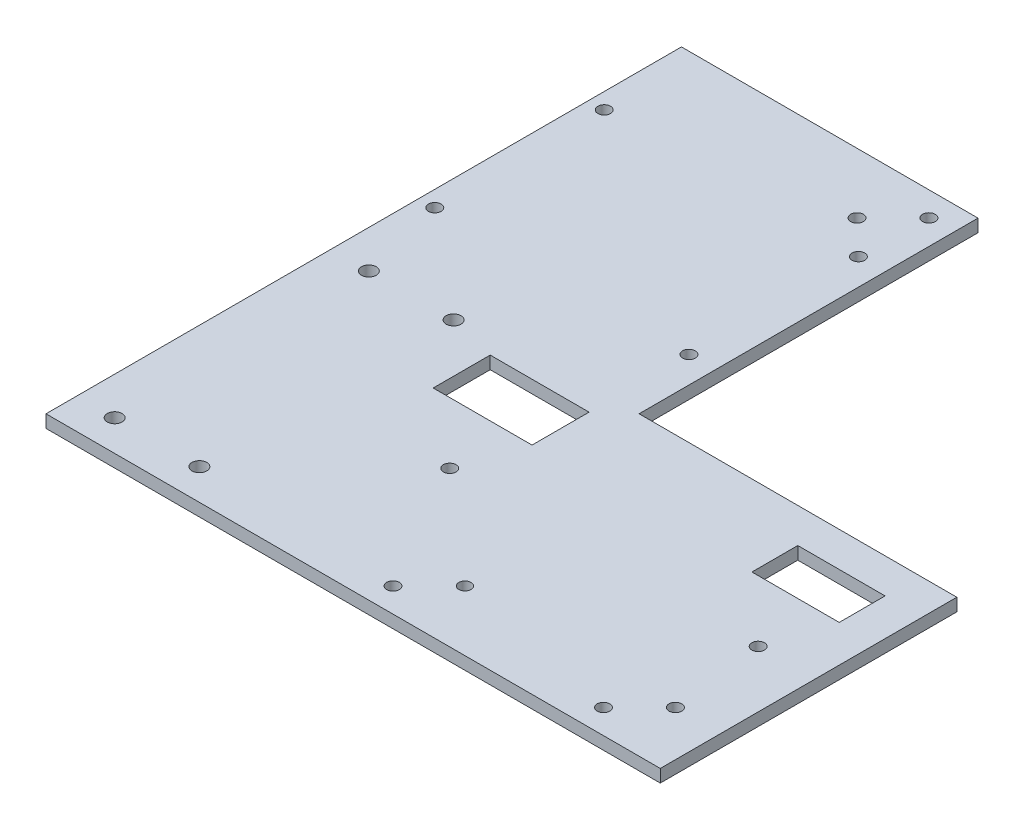
ISO-10303-21;
HEADER;
FILE_DESCRIPTION(('STEP AP214'),'2;1');
FILE_NAME('part.step','',(''),(''),'','','');
FILE_SCHEMA(('AUTOMOTIVE_DESIGN { 1 0 10303 214 1 1 1 1 }'));
ENDSEC;
DATA;
#1=APPLICATION_CONTEXT('core data for automotive mechanical design processes');
#2=APPLICATION_PROTOCOL_DEFINITION('international standard','automotive_design',2000,#1);
#3=PRODUCT_CONTEXT('',#1,'mechanical');
#4=PRODUCT('Part','Part','',(#3));
#5=PRODUCT_RELATED_PRODUCT_CATEGORY('part','',(#4));
#6=PRODUCT_DEFINITION_FORMATION('','',#4);
#7=PRODUCT_DEFINITION_CONTEXT('part definition',#1,'design');
#8=PRODUCT_DEFINITION('design','',#6,#7);
#9=PRODUCT_DEFINITION_SHAPE('','',#8);
#10=(LENGTH_UNIT() NAMED_UNIT(*) SI_UNIT(.MILLI.,.METRE.));
#11=(NAMED_UNIT(*) PLANE_ANGLE_UNIT() SI_UNIT($,.RADIAN.));
#12=(NAMED_UNIT(*) SI_UNIT($,.STERADIAN.) SOLID_ANGLE_UNIT());
#13=UNCERTAINTY_MEASURE_WITH_UNIT(LENGTH_MEASURE(1.E-05),#10,'distance_accuracy_value','');
#14=(GEOMETRIC_REPRESENTATION_CONTEXT(3) GLOBAL_UNCERTAINTY_ASSIGNED_CONTEXT((#13)) GLOBAL_UNIT_ASSIGNED_CONTEXT((#10,
#11,#12)) REPRESENTATION_CONTEXT('',''));
#15=CARTESIAN_POINT('',(0.,0.,0.));
#16=DIRECTION('',(0.,0.,1.));
#17=DIRECTION('',(1.,0.,0.));
#18=AXIS2_PLACEMENT_3D('',#15,#16,#17);
#19=CARTESIAN_POINT('',(0.,3.,0.));
#20=DIRECTION('',(0.,1.,0.));
#21=DIRECTION('',(0.,0.,1.));
#22=AXIS2_PLACEMENT_3D('',#19,#20,#21);
#23=PLANE('',#22);
#24=CARTESIAN_POINT('',(-8.74039531155943,3.,-93.0097306320693));
#25=DIRECTION('',(0.,1.,0.));
#26=DIRECTION('',(0.,0.,1.));
#27=AXIS2_PLACEMENT_3D('',#24,#25,#26);
#28=CIRCLE('',#27,1.5);
#29=CARTESIAN_POINT('',(-8.74039531155943,3.,-91.5097306320693));
#30=VERTEX_POINT('',#29);
#31=EDGE_CURVE('E211',#30,#30,#28,.T.);
#32=ORIENTED_EDGE('',*,*,#31,.F.);
#33=EDGE_LOOP('',(#32));
#34=FACE_BOUND('',#33,.T.);
#35=CARTESIAN_POINT('',(-68.7403953115594,3.,-53.0097306320694));
#36=DIRECTION('',(0.,1.,0.));
#37=DIRECTION('',(0.,0.,1.));
#38=AXIS2_PLACEMENT_3D('',#35,#36,#37);
#39=CIRCLE('',#38,1.5);
#40=CARTESIAN_POINT('',(-68.7403953115594,3.,-51.5097306320694));
#41=VERTEX_POINT('',#40);
#42=EDGE_CURVE('E223',#41,#41,#39,.T.);
#43=ORIENTED_EDGE('',*,*,#42,.F.);
#44=EDGE_LOOP('',(#43));
#45=FACE_BOUND('',#44,.T.);
#46=CARTESIAN_POINT('',(-43.5845661937759,3.,-32.2893631834184));
#47=DIRECTION('',(0.,1.,0.));
#48=DIRECTION('',(0.,0.,1.));
#49=AXIS2_PLACEMENT_3D('',#46,#47,#48);
#50=CIRCLE('',#49,1.75);
#51=CARTESIAN_POINT('',(-43.5845661937759,3.,-30.5393631834184));
#52=VERTEX_POINT('',#51);
#53=EDGE_CURVE('E235',#52,#52,#50,.T.);
#54=ORIENTED_EDGE('',*,*,#53,.F.);
#55=EDGE_LOOP('',(#54));
#56=FACE_BOUND('',#55,.T.);
#57=CARTESIAN_POINT('',(-63.5845661937668,3.,27.7106368165827));
#58=DIRECTION('',(0.,1.,0.));
#59=DIRECTION('',(0.,0.,1.));
#60=AXIS2_PLACEMENT_3D('',#57,#58,#59);
#61=CIRCLE('',#60,1.75);
#62=CARTESIAN_POINT('',(-63.5845661937668,3.,29.4606368165827));
#63=VERTEX_POINT('',#62);
#64=EDGE_CURVE('E247',#63,#63,#61,.T.);
#65=ORIENTED_EDGE('',*,*,#64,.F.);
#66=EDGE_LOOP('',(#65));
#67=FACE_BOUND('',#66,.T.);
#68=CARTESIAN_POINT('',(-13.6998219902886,3.,-1.50000000000002));
#69=DIRECTION('',(0.,1.,0.));
#70=DIRECTION('',(0.,0.,1.));
#71=AXIS2_PLACEMENT_3D('',#68,#69,#70);
#72=CIRCLE('',#71,1.5);
#73=CARTESIAN_POINT('',(-13.6998219902886,3.,0.));
#74=VERTEX_POINT('',#73);
#75=EDGE_CURVE('E259',#74,#74,#72,.T.);
#76=ORIENTED_EDGE('',*,*,#75,.F.);
#77=EDGE_LOOP('',(#76));
#78=FACE_BOUND('',#77,.T.);
#79=CARTESIAN_POINT('',(-16.8143550150383,3.,-100.757359312881));
#80=DIRECTION('',(0.,1.,0.));
#81=DIRECTION('',(0.,0.,1.));
#82=AXIS2_PLACEMENT_3D('',#79,#80,#81);
#83=CIRCLE('',#82,1.5);
#84=CARTESIAN_POINT('',(-16.8143550150383,3.,-99.2573593128807));
#85=VERTEX_POINT('',#84);
#86=EDGE_CURVE('E271',#85,#85,#83,.T.);
#87=ORIENTED_EDGE('',*,*,#86,.F.);
#88=EDGE_LOOP('',(#87));
#89=FACE_BOUND('',#88,.T.);
#90=CARTESIAN_POINT('',(53.3380950751253,3.,29.2426406871193));
#91=DIRECTION('',(0.,1.,0.));
#92=DIRECTION('',(0.,0.,1.));
#93=AXIS2_PLACEMENT_3D('',#90,#91,#92);
#94=CIRCLE('',#93,1.5);
#95=CARTESIAN_POINT('',(53.3380950751253,3.,30.7426406871193));
#96=VERTEX_POINT('',#95);
#97=EDGE_CURVE('E283',#96,#96,#94,.T.);
#98=ORIENTED_EDGE('',*,*,#97,.F.);
#99=EDGE_LOOP('',(#98));
#100=FACE_BOUND('',#99,.T.);
#101=CARTESIAN_POINT('',(3.6548279936358,3.,29.2426406871193));
#102=DIRECTION('',(0.,1.,0.));
#103=DIRECTION('',(0.,0.,1.));
#104=AXIS2_PLACEMENT_3D('',#101,#102,#103);
#105=CIRCLE('',#104,1.5);
#106=CARTESIAN_POINT('',(3.6548279936358,3.,30.7426406871193));
#107=VERTEX_POINT('',#106);
#108=EDGE_CURVE('E295',#107,#107,#105,.T.);
#109=ORIENTED_EDGE('',*,*,#108,.F.);
#110=EDGE_LOOP('',(#109));
#111=FACE_BOUND('',#110,.T.);
#112=DIRECTION('',(-1.,0.,0.));
#113=VECTOR('',#112,1.);
#114=CARTESIAN_POINT('',(-2.50000000000002,3.,-35.));
#115=LINE('',#114,#113);
#116=CARTESIAN_POINT('',(72.5,3.,-35.));
#117=VERTEX_POINT('',#116);
#118=CARTESIAN_POINT('',(-2.50000000000002,3.,-35.));
#119=VERTEX_POINT('',#118);
#120=EDGE_CURVE('E301',#117,#119,#115,.T.);
#121=ORIENTED_EDGE('',*,*,#120,.T.);
#122=DIRECTION('',(0.,0.,-1.));
#123=VECTOR('',#122,1.);
#124=CARTESIAN_POINT('',(-2.50000000000002,3.,-35.));
#125=LINE('',#124,#123);
#126=CARTESIAN_POINT('',(-2.50000000000002,3.,-115.));
#127=VERTEX_POINT('',#126);
#128=EDGE_CURVE('E304',#119,#127,#125,.T.);
#129=ORIENTED_EDGE('',*,*,#128,.T.);
#130=DIRECTION('',(-1.,0.,0.));
#131=VECTOR('',#130,1.);
#132=CARTESIAN_POINT('',(-72.5,3.,-115.));
#133=LINE('',#132,#131);
#134=CARTESIAN_POINT('',(-72.5,3.,-115.));
#135=VERTEX_POINT('',#134);
#136=EDGE_CURVE('E307',#127,#135,#133,.T.);
#137=ORIENTED_EDGE('',*,*,#136,.T.);
#138=DIRECTION('',(0.,0.,1.));
#139=VECTOR('',#138,1.);
#140=CARTESIAN_POINT('',(-72.5,3.,-35.));
#141=LINE('',#140,#139);
#142=CARTESIAN_POINT('',(-72.5,3.,35.));
#143=VERTEX_POINT('',#142);
#144=EDGE_CURVE('E309',#135,#143,#141,.T.);
#145=ORIENTED_EDGE('',*,*,#144,.T.);
#146=DIRECTION('',(1.,0.,0.));
#147=VECTOR('',#146,1.);
#148=CARTESIAN_POINT('',(-72.5,3.,35.));
#149=LINE('',#148,#147);
#150=CARTESIAN_POINT('',(72.5,3.,35.));
#151=VERTEX_POINT('',#150);
#152=EDGE_CURVE('E311',#143,#151,#149,.T.);
#153=ORIENTED_EDGE('',*,*,#152,.T.);
#154=DIRECTION('',(0.,0.,-1.));
#155=VECTOR('',#154,1.);
#156=CARTESIAN_POINT('',(72.5,3.,35.));
#157=LINE('',#156,#155);
#158=EDGE_CURVE('E313',#151,#117,#157,.T.);
#159=ORIENTED_EDGE('',*,*,#158,.T.);
#160=EDGE_LOOP('',(#121,#129,#137,#145,#153,#159));
#161=FACE_BOUND('',#160,.T.);
#162=CARTESIAN_POINT('',(12.1401093678744,3.,20.7573593128807));
#163=DIRECTION('',(0.,1.,0.));
#164=DIRECTION('',(0.,0.,1.));
#165=AXIS2_PLACEMENT_3D('',#162,#163,#164);
#166=CIRCLE('',#165,1.44463942022742);
#167=CARTESIAN_POINT('',(12.1401093678744,3.,22.2019987331082));
#168=VERTEX_POINT('',#167);
#169=EDGE_CURVE('E289',#168,#168,#166,.T.);
#170=ORIENTED_EDGE('',*,*,#169,.F.);
#171=EDGE_LOOP('',(#170));
#172=FACE_BOUND('',#171,.T.);
#173=CARTESIAN_POINT('',(61.8233764493638,3.,20.7573593128807));
#174=DIRECTION('',(0.,1.,0.));
#175=DIRECTION('',(0.,0.,1.));
#176=AXIS2_PLACEMENT_3D('',#173,#174,#175);
#177=CIRCLE('',#176,1.49999999999998);
#178=CARTESIAN_POINT('',(61.8233764493638,3.,22.2573593128807));
#179=VERTEX_POINT('',#178);
#180=EDGE_CURVE('E277',#179,#179,#177,.T.);
#181=ORIENTED_EDGE('',*,*,#180,.F.);
#182=EDGE_LOOP('',(#181));
#183=FACE_BOUND('',#182,.T.);
#184=CARTESIAN_POINT('',(-8.32907364079969,3.,-109.242640687119));
#185=DIRECTION('',(0.,1.,0.));
#186=DIRECTION('',(0.,0.,1.));
#187=AXIS2_PLACEMENT_3D('',#184,#185,#186);
#188=CIRCLE('',#187,1.5);
#189=CARTESIAN_POINT('',(-8.32907364079969,3.,-107.742640687119));
#190=VERTEX_POINT('',#189);
#191=EDGE_CURVE('E265',#190,#190,#188,.T.);
#192=ORIENTED_EDGE('',*,*,#191,.F.);
#193=EDGE_LOOP('',(#192));
#194=FACE_BOUND('',#193,.T.);
#195=CARTESIAN_POINT('',(59.1092379606102,3.,-1.50000000000002));
#196=DIRECTION('',(0.,1.,0.));
#197=DIRECTION('',(0.,0.,1.));
#198=AXIS2_PLACEMENT_3D('',#195,#196,#197);
#199=CIRCLE('',#198,1.5);
#200=CARTESIAN_POINT('',(59.1092379606102,3.,0.));
#201=VERTEX_POINT('',#200);
#202=EDGE_CURVE('E253',#201,#201,#199,.T.);
#203=ORIENTED_EDGE('',*,*,#202,.F.);
#204=EDGE_LOOP('',(#203));
#205=FACE_BOUND('',#204,.T.);
#206=CARTESIAN_POINT('',(-43.5845661937759,3.,27.7106368165827));
#207=DIRECTION('',(0.,1.,0.));
#208=DIRECTION('',(0.,0.,1.));
#209=AXIS2_PLACEMENT_3D('',#206,#207,#208);
#210=CIRCLE('',#209,1.75);
#211=CARTESIAN_POINT('',(-43.5845661937759,3.,29.4606368165827));
#212=VERTEX_POINT('',#211);
#213=EDGE_CURVE('E241',#212,#212,#210,.T.);
#214=ORIENTED_EDGE('',*,*,#213,.F.);
#215=EDGE_LOOP('',(#214));
#216=FACE_BOUND('',#215,.T.);
#217=CARTESIAN_POINT('',(-63.5845661937668,3.,-32.2893631834184));
#218=DIRECTION('',(0.,1.,0.));
#219=DIRECTION('',(0.,0.,1.));
#220=AXIS2_PLACEMENT_3D('',#217,#218,#219);
#221=CIRCLE('',#220,1.75);
#222=CARTESIAN_POINT('',(-63.5845661937668,3.,-30.5393631834184));
#223=VERTEX_POINT('',#222);
#224=EDGE_CURVE('E229',#223,#223,#221,.T.);
#225=ORIENTED_EDGE('',*,*,#224,.F.);
#226=EDGE_LOOP('',(#225));
#227=FACE_BOUND('',#226,.T.);
#228=CARTESIAN_POINT('',(-68.7403953115594,3.,-93.0097306320693));
#229=DIRECTION('',(0.,1.,0.));
#230=DIRECTION('',(0.,0.,1.));
#231=AXIS2_PLACEMENT_3D('',#228,#229,#230);
#232=CIRCLE('',#231,1.5);
#233=CARTESIAN_POINT('',(-68.7403953115594,3.,-91.5097306320693));
#234=VERTEX_POINT('',#233);
#235=EDGE_CURVE('E217',#234,#234,#232,.T.);
#236=ORIENTED_EDGE('',*,*,#235,.F.);
#237=EDGE_LOOP('',(#236));
#238=FACE_BOUND('',#237,.T.);
#239=CARTESIAN_POINT('',(-8.74039531155943,3.,-53.0097306320694));
#240=DIRECTION('',(0.,1.,0.));
#241=DIRECTION('',(0.,0.,1.));
#242=AXIS2_PLACEMENT_3D('',#239,#240,#241);
#243=CIRCLE('',#242,1.5);
#244=CARTESIAN_POINT('',(-8.74039531155943,3.,-51.5097306320694));
#245=VERTEX_POINT('',#244);
#246=EDGE_CURVE('E205',#245,#245,#243,.T.);
#247=ORIENTED_EDGE('',*,*,#246,.F.);
#248=EDGE_LOOP('',(#247));
#249=FACE_BOUND('',#248,.T.);
#250=DIRECTION('',(-1.,0.,0.));
#251=VECTOR('',#250,1.);
#252=CARTESIAN_POINT('',(-32.07311887779,3.,-29.429238987531));
#253=LINE('',#252,#251);
#254=CARTESIAN_POINT('',(-8.74039531155943,3.,-29.429238987531));
#255=VERTEX_POINT('',#254);
#256=CARTESIAN_POINT('',(-32.07311887779,3.,-29.429238987531));
#257=VERTEX_POINT('',#256);
#258=EDGE_CURVE('E176',#255,#257,#253,.T.);
#259=ORIENTED_EDGE('',*,*,#258,.F.);
#260=DIRECTION('',(0.,0.,-1.));
#261=VECTOR('',#260,1.);
#262=CARTESIAN_POINT('',(-8.74039531155943,3.,-15.970761012469));
#263=LINE('',#262,#261);
#264=CARTESIAN_POINT('',(-8.74039531155943,3.,-15.970761012469));
#265=VERTEX_POINT('',#264);
#266=EDGE_CURVE('E174',#265,#255,#263,.T.);
#267=ORIENTED_EDGE('',*,*,#266,.F.);
#268=DIRECTION('',(1.,0.,0.));
#269=VECTOR('',#268,1.);
#270=CARTESIAN_POINT('',(-32.07311887779,3.,-15.970761012469));
#271=LINE('',#270,#269);
#272=CARTESIAN_POINT('',(-32.07311887779,3.,-15.970761012469));
#273=VERTEX_POINT('',#272);
#274=EDGE_CURVE('E182',#273,#265,#271,.T.);
#275=ORIENTED_EDGE('',*,*,#274,.F.);
#276=DIRECTION('',(0.,0.,1.));
#277=VECTOR('',#276,1.);
#278=CARTESIAN_POINT('',(-32.07311887779,3.,-15.970761012469));
#279=LINE('',#278,#277);
#280=EDGE_CURVE('E179',#257,#273,#279,.T.);
#281=ORIENTED_EDGE('',*,*,#280,.F.);
#282=EDGE_LOOP('',(#259,#267,#275,#281));
#283=FACE_BOUND('',#282,.T.);
#284=DIRECTION('',(-1.,0.,0.));
#285=VECTOR('',#284,1.);
#286=CARTESIAN_POINT('',(43.16421890266,3.,-26.7967682155103));
#287=LINE('',#286,#285);
#288=CARTESIAN_POINT('',(63.7708041360365,3.,-26.7967682155103));
#289=VERTEX_POINT('',#288);
#290=CARTESIAN_POINT('',(43.16421890266,3.,-26.7967682155103));
#291=VERTEX_POINT('',#290);
#292=EDGE_CURVE('E146',#289,#291,#287,.T.);
#293=ORIENTED_EDGE('',*,*,#292,.F.);
#294=DIRECTION('',(0.,0.,-1.));
#295=VECTOR('',#294,1.);
#296=CARTESIAN_POINT('',(63.7708041360365,3.,-26.7967682155103));
#297=LINE('',#296,#295);
#298=CARTESIAN_POINT('',(63.7708041360365,3.,-15.970761012469));
#299=VERTEX_POINT('',#298);
#300=EDGE_CURVE('E138',#299,#289,#297,.T.);
#301=ORIENTED_EDGE('',*,*,#300,.F.);
#302=DIRECTION('',(1.,0.,0.));
#303=VECTOR('',#302,1.);
#304=CARTESIAN_POINT('',(43.16421890266,3.,-15.970761012469));
#305=LINE('',#304,#303);
#306=CARTESIAN_POINT('',(43.16421890266,3.,-15.970761012469));
#307=VERTEX_POINT('',#306);
#308=EDGE_CURVE('E160',#307,#299,#305,.T.);
#309=ORIENTED_EDGE('',*,*,#308,.F.);
#310=DIRECTION('',(0.,0.,1.));
#311=VECTOR('',#310,1.);
#312=CARTESIAN_POINT('',(43.16421890266,3.,-26.7967682155103));
#313=LINE('',#312,#311);
#314=EDGE_CURVE('E158',#291,#307,#313,.T.);
#315=ORIENTED_EDGE('',*,*,#314,.F.);
#316=EDGE_LOOP('',(#293,#301,#309,#315));
#317=FACE_BOUND('',#316,.T.);
#318=ADVANCED_FACE('F37',(#34,#45,#56,#67,#78,#89,#100,#111,#161,#172,#183,#194,#205,#216,#227,
#238,#249,#283,#317),#23,.T.);
#319=CARTESIAN_POINT('',(0.,0.,0.));
#320=DIRECTION('',(0.,1.,0.));
#321=DIRECTION('',(0.,0.,1.));
#322=AXIS2_PLACEMENT_3D('',#319,#320,#321);
#323=PLANE('',#322);
#324=DIRECTION('',(0.,0.,-1.));
#325=VECTOR('',#324,1.);
#326=CARTESIAN_POINT('',(-8.74039531155943,0.,-15.970761012469));
#327=LINE('',#326,#325);
#328=CARTESIAN_POINT('',(-8.74039531155943,0.,-15.970761012469));
#329=VERTEX_POINT('',#328);
#330=CARTESIAN_POINT('',(-8.74039531155943,0.,-29.429238987531));
#331=VERTEX_POINT('',#330);
#332=EDGE_CURVE('E154',#329,#331,#327,.T.);
#333=ORIENTED_EDGE('',*,*,#332,.T.);
#334=DIRECTION('',(-1.,0.,0.));
#335=VECTOR('',#334,1.);
#336=CARTESIAN_POINT('',(-32.07311887779,0.,-29.429238987531));
#337=LINE('',#336,#335);
#338=CARTESIAN_POINT('',(-32.07311887779,0.,-29.429238987531));
#339=VERTEX_POINT('',#338);
#340=EDGE_CURVE('E187',#331,#339,#337,.T.);
#341=ORIENTED_EDGE('',*,*,#340,.T.);
#342=DIRECTION('',(0.,0.,1.));
#343=VECTOR('',#342,1.);
#344=CARTESIAN_POINT('',(-32.07311887779,0.,-15.970761012469));
#345=LINE('',#344,#343);
#346=CARTESIAN_POINT('',(-32.07311887779,0.,-15.970761012469));
#347=VERTEX_POINT('',#346);
#348=EDGE_CURVE('E190',#339,#347,#345,.T.);
#349=ORIENTED_EDGE('',*,*,#348,.T.);
#350=DIRECTION('',(1.,0.,0.));
#351=VECTOR('',#350,1.);
#352=CARTESIAN_POINT('',(-32.07311887779,0.,-15.970761012469));
#353=LINE('',#352,#351);
#354=EDGE_CURVE('E177',#347,#329,#353,.T.);
#355=ORIENTED_EDGE('',*,*,#354,.T.);
#356=EDGE_LOOP('',(#333,#341,#349,#355));
#357=FACE_BOUND('',#356,.T.);
#358=DIRECTION('',(-1.,0.,0.));
#359=VECTOR('',#358,1.);
#360=CARTESIAN_POINT('',(-2.50000000000002,0.,-35.));
#361=LINE('',#360,#359);
#362=CARTESIAN_POINT('',(72.5,0.,-35.));
#363=VERTEX_POINT('',#362);
#364=CARTESIAN_POINT('',(-2.50000000000002,0.,-35.));
#365=VERTEX_POINT('',#364);
#366=EDGE_CURVE('E298',#363,#365,#361,.T.);
#367=ORIENTED_EDGE('',*,*,#366,.F.);
#368=DIRECTION('',(0.,0.,-1.));
#369=VECTOR('',#368,1.);
#370=CARTESIAN_POINT('',(72.5,0.,35.));
#371=LINE('',#370,#369);
#372=CARTESIAN_POINT('',(72.5,0.,35.));
#373=VERTEX_POINT('',#372);
#374=EDGE_CURVE('E305',#373,#363,#371,.T.);
#375=ORIENTED_EDGE('',*,*,#374,.F.);
#376=DIRECTION('',(1.,0.,0.));
#377=VECTOR('',#376,1.);
#378=CARTESIAN_POINT('',(-72.5,0.,35.));
#379=LINE('',#378,#377);
#380=CARTESIAN_POINT('',(-72.5,0.,35.));
#381=VERTEX_POINT('',#380);
#382=EDGE_CURVE('E325',#381,#373,#379,.T.);
#383=ORIENTED_EDGE('',*,*,#382,.F.);
#384=DIRECTION('',(0.,0.,1.));
#385=VECTOR('',#384,1.);
#386=CARTESIAN_POINT('',(-72.5,0.,35.));
#387=LINE('',#386,#385);
#388=CARTESIAN_POINT('',(-72.5,0.,-115.));
#389=VERTEX_POINT('',#388);
#390=EDGE_CURVE('E323',#389,#381,#387,.T.);
#391=ORIENTED_EDGE('',*,*,#390,.F.);
#392=DIRECTION('',(-1.,0.,0.));
#393=VECTOR('',#392,1.);
#394=CARTESIAN_POINT('',(-72.5,0.,-115.));
#395=LINE('',#394,#393);
#396=CARTESIAN_POINT('',(-2.50000000000002,0.,-115.));
#397=VERTEX_POINT('',#396);
#398=EDGE_CURVE('E320',#397,#389,#395,.T.);
#399=ORIENTED_EDGE('',*,*,#398,.F.);
#400=DIRECTION('',(0.,0.,-1.));
#401=VECTOR('',#400,1.);
#402=CARTESIAN_POINT('',(-2.50000000000002,0.,-35.));
#403=LINE('',#402,#401);
#404=EDGE_CURVE('E318',#365,#397,#403,.T.);
#405=ORIENTED_EDGE('',*,*,#404,.F.);
#406=EDGE_LOOP('',(#367,#375,#383,#391,#399,#405));
#407=FACE_BOUND('',#406,.T.);
#408=CARTESIAN_POINT('',(3.6548279936358,0.,29.2426406871193));
#409=DIRECTION('',(0.,1.,0.));
#410=DIRECTION('',(0.,0.,1.));
#411=AXIS2_PLACEMENT_3D('',#408,#409,#410);
#412=CIRCLE('',#411,1.5);
#413=CARTESIAN_POINT('',(3.6548279936358,0.,30.7426406871193));
#414=VERTEX_POINT('',#413);
#415=EDGE_CURVE('E292',#414,#414,#412,.T.);
#416=ORIENTED_EDGE('',*,*,#415,.T.);
#417=EDGE_LOOP('',(#416));
#418=FACE_BOUND('',#417,.T.);
#419=CARTESIAN_POINT('',(12.1401093678744,0.,20.7573593128807));
#420=DIRECTION('',(0.,1.,0.));
#421=DIRECTION('',(0.,0.,1.));
#422=AXIS2_PLACEMENT_3D('',#419,#420,#421);
#423=CIRCLE('',#422,1.44463942022742);
#424=CARTESIAN_POINT('',(12.1401093678744,0.,22.2019987331082));
#425=VERTEX_POINT('',#424);
#426=EDGE_CURVE('E286',#425,#425,#423,.T.);
#427=ORIENTED_EDGE('',*,*,#426,.T.);
#428=EDGE_LOOP('',(#427));
#429=FACE_BOUND('',#428,.T.);
#430=CARTESIAN_POINT('',(53.3380950751253,0.,29.2426406871193));
#431=DIRECTION('',(0.,1.,0.));
#432=DIRECTION('',(0.,0.,1.));
#433=AXIS2_PLACEMENT_3D('',#430,#431,#432);
#434=CIRCLE('',#433,1.5);
#435=CARTESIAN_POINT('',(53.3380950751253,0.,30.7426406871193));
#436=VERTEX_POINT('',#435);
#437=EDGE_CURVE('E280',#436,#436,#434,.T.);
#438=ORIENTED_EDGE('',*,*,#437,.T.);
#439=EDGE_LOOP('',(#438));
#440=FACE_BOUND('',#439,.T.);
#441=CARTESIAN_POINT('',(61.8233764493638,0.,20.7573593128807));
#442=DIRECTION('',(0.,1.,0.));
#443=DIRECTION('',(0.,0.,1.));
#444=AXIS2_PLACEMENT_3D('',#441,#442,#443);
#445=CIRCLE('',#444,1.49999999999998);
#446=CARTESIAN_POINT('',(61.8233764493638,0.,22.2573593128807));
#447=VERTEX_POINT('',#446);
#448=EDGE_CURVE('E274',#447,#447,#445,.T.);
#449=ORIENTED_EDGE('',*,*,#448,.T.);
#450=EDGE_LOOP('',(#449));
#451=FACE_BOUND('',#450,.T.);
#452=CARTESIAN_POINT('',(-16.8143550150383,0.,-100.757359312881));
#453=DIRECTION('',(0.,1.,0.));
#454=DIRECTION('',(0.,0.,1.));
#455=AXIS2_PLACEMENT_3D('',#452,#453,#454);
#456=CIRCLE('',#455,1.5);
#457=CARTESIAN_POINT('',(-16.8143550150383,0.,-99.2573593128807));
#458=VERTEX_POINT('',#457);
#459=EDGE_CURVE('E268',#458,#458,#456,.T.);
#460=ORIENTED_EDGE('',*,*,#459,.T.);
#461=EDGE_LOOP('',(#460));
#462=FACE_BOUND('',#461,.T.);
#463=CARTESIAN_POINT('',(-8.32907364079969,0.,-109.242640687119));
#464=DIRECTION('',(0.,1.,0.));
#465=DIRECTION('',(0.,0.,1.));
#466=AXIS2_PLACEMENT_3D('',#463,#464,#465);
#467=CIRCLE('',#466,1.5);
#468=CARTESIAN_POINT('',(-8.32907364079969,0.,-107.742640687119));
#469=VERTEX_POINT('',#468);
#470=EDGE_CURVE('E262',#469,#469,#467,.T.);
#471=ORIENTED_EDGE('',*,*,#470,.T.);
#472=EDGE_LOOP('',(#471));
#473=FACE_BOUND('',#472,.T.);
#474=CARTESIAN_POINT('',(-13.6998219902886,0.,-1.50000000000002));
#475=DIRECTION('',(0.,1.,0.));
#476=DIRECTION('',(0.,0.,1.));
#477=AXIS2_PLACEMENT_3D('',#474,#475,#476);
#478=CIRCLE('',#477,1.5);
#479=CARTESIAN_POINT('',(-13.6998219902886,0.,0.));
#480=VERTEX_POINT('',#479);
#481=EDGE_CURVE('E256',#480,#480,#478,.T.);
#482=ORIENTED_EDGE('',*,*,#481,.T.);
#483=EDGE_LOOP('',(#482));
#484=FACE_BOUND('',#483,.T.);
#485=CARTESIAN_POINT('',(59.1092379606102,0.,-1.50000000000002));
#486=DIRECTION('',(0.,1.,0.));
#487=DIRECTION('',(0.,0.,1.));
#488=AXIS2_PLACEMENT_3D('',#485,#486,#487);
#489=CIRCLE('',#488,1.5);
#490=CARTESIAN_POINT('',(59.1092379606102,0.,0.));
#491=VERTEX_POINT('',#490);
#492=EDGE_CURVE('E250',#491,#491,#489,.T.);
#493=ORIENTED_EDGE('',*,*,#492,.T.);
#494=EDGE_LOOP('',(#493));
#495=FACE_BOUND('',#494,.T.);
#496=CARTESIAN_POINT('',(-63.5845661937668,0.,27.7106368165827));
#497=DIRECTION('',(0.,1.,0.));
#498=DIRECTION('',(0.,0.,1.));
#499=AXIS2_PLACEMENT_3D('',#496,#497,#498);
#500=CIRCLE('',#499,1.75);
#501=CARTESIAN_POINT('',(-63.5845661937668,0.,29.4606368165827));
#502=VERTEX_POINT('',#501);
#503=EDGE_CURVE('E244',#502,#502,#500,.T.);
#504=ORIENTED_EDGE('',*,*,#503,.T.);
#505=EDGE_LOOP('',(#504));
#506=FACE_BOUND('',#505,.T.);
#507=CARTESIAN_POINT('',(-43.5845661937759,0.,27.7106368165827));
#508=DIRECTION('',(0.,1.,0.));
#509=DIRECTION('',(0.,0.,1.));
#510=AXIS2_PLACEMENT_3D('',#507,#508,#509);
#511=CIRCLE('',#510,1.75);
#512=CARTESIAN_POINT('',(-43.5845661937759,0.,29.4606368165827));
#513=VERTEX_POINT('',#512);
#514=EDGE_CURVE('E238',#513,#513,#511,.T.);
#515=ORIENTED_EDGE('',*,*,#514,.T.);
#516=EDGE_LOOP('',(#515));
#517=FACE_BOUND('',#516,.T.);
#518=CARTESIAN_POINT('',(-43.5845661937759,0.,-32.2893631834184));
#519=DIRECTION('',(0.,1.,0.));
#520=DIRECTION('',(0.,0.,1.));
#521=AXIS2_PLACEMENT_3D('',#518,#519,#520);
#522=CIRCLE('',#521,1.75);
#523=CARTESIAN_POINT('',(-43.5845661937759,0.,-30.5393631834184));
#524=VERTEX_POINT('',#523);
#525=EDGE_CURVE('E232',#524,#524,#522,.T.);
#526=ORIENTED_EDGE('',*,*,#525,.T.);
#527=EDGE_LOOP('',(#526));
#528=FACE_BOUND('',#527,.T.);
#529=CARTESIAN_POINT('',(-63.5845661937668,0.,-32.2893631834184));
#530=DIRECTION('',(0.,1.,0.));
#531=DIRECTION('',(0.,0.,1.));
#532=AXIS2_PLACEMENT_3D('',#529,#530,#531);
#533=CIRCLE('',#532,1.75);
#534=CARTESIAN_POINT('',(-63.5845661937668,0.,-30.5393631834184));
#535=VERTEX_POINT('',#534);
#536=EDGE_CURVE('E226',#535,#535,#533,.T.);
#537=ORIENTED_EDGE('',*,*,#536,.T.);
#538=EDGE_LOOP('',(#537));
#539=FACE_BOUND('',#538,.T.);
#540=CARTESIAN_POINT('',(-68.7403953115594,0.,-53.0097306320694));
#541=DIRECTION('',(0.,1.,0.));
#542=DIRECTION('',(0.,0.,1.));
#543=AXIS2_PLACEMENT_3D('',#540,#541,#542);
#544=CIRCLE('',#543,1.5);
#545=CARTESIAN_POINT('',(-68.7403953115594,0.,-51.5097306320694));
#546=VERTEX_POINT('',#545);
#547=EDGE_CURVE('E220',#546,#546,#544,.T.);
#548=ORIENTED_EDGE('',*,*,#547,.T.);
#549=EDGE_LOOP('',(#548));
#550=FACE_BOUND('',#549,.T.);
#551=CARTESIAN_POINT('',(-68.7403953115594,0.,-93.0097306320693));
#552=DIRECTION('',(0.,1.,0.));
#553=DIRECTION('',(0.,0.,1.));
#554=AXIS2_PLACEMENT_3D('',#551,#552,#553);
#555=CIRCLE('',#554,1.5);
#556=CARTESIAN_POINT('',(-68.7403953115594,0.,-91.5097306320693));
#557=VERTEX_POINT('',#556);
#558=EDGE_CURVE('E214',#557,#557,#555,.T.);
#559=ORIENTED_EDGE('',*,*,#558,.T.);
#560=EDGE_LOOP('',(#559));
#561=FACE_BOUND('',#560,.T.);
#562=CARTESIAN_POINT('',(-8.74039531155943,0.,-93.0097306320693));
#563=DIRECTION('',(0.,1.,0.));
#564=DIRECTION('',(0.,0.,1.));
#565=AXIS2_PLACEMENT_3D('',#562,#563,#564);
#566=CIRCLE('',#565,1.5);
#567=CARTESIAN_POINT('',(-8.74039531155943,0.,-91.5097306320693));
#568=VERTEX_POINT('',#567);
#569=EDGE_CURVE('E208',#568,#568,#566,.T.);
#570=ORIENTED_EDGE('',*,*,#569,.T.);
#571=EDGE_LOOP('',(#570));
#572=FACE_BOUND('',#571,.T.);
#573=CARTESIAN_POINT('',(-8.74039531155943,0.,-53.0097306320694));
#574=DIRECTION('',(0.,1.,0.));
#575=DIRECTION('',(0.,0.,1.));
#576=AXIS2_PLACEMENT_3D('',#573,#574,#575);
#577=CIRCLE('',#576,1.5);
#578=CARTESIAN_POINT('',(-8.74039531155943,0.,-51.5097306320694));
#579=VERTEX_POINT('',#578);
#580=EDGE_CURVE('E204',#579,#579,#577,.T.);
#581=ORIENTED_EDGE('',*,*,#580,.T.);
#582=EDGE_LOOP('',(#581));
#583=FACE_BOUND('',#582,.T.);
#584=DIRECTION('',(0.,0.,-1.));
#585=VECTOR('',#584,1.);
#586=CARTESIAN_POINT('',(63.7708041360365,0.,-26.7967682155103));
#587=LINE('',#586,#585);
#588=CARTESIAN_POINT('',(63.7708041360365,0.,-15.970761012469));
#589=VERTEX_POINT('',#588);
#590=CARTESIAN_POINT('',(63.7708041360365,0.,-26.7967682155103));
#591=VERTEX_POINT('',#590);
#592=EDGE_CURVE('E60',#589,#591,#587,.T.);
#593=ORIENTED_EDGE('',*,*,#592,.T.);
#594=DIRECTION('',(-1.,0.,0.));
#595=VECTOR('',#594,1.);
#596=CARTESIAN_POINT('',(43.16421890266,0.,-26.7967682155103));
#597=LINE('',#596,#595);
#598=CARTESIAN_POINT('',(43.16421890266,0.,-26.7967682155103));
#599=VERTEX_POINT('',#598);
#600=EDGE_CURVE('E153',#591,#599,#597,.T.);
#601=ORIENTED_EDGE('',*,*,#600,.T.);
#602=DIRECTION('',(0.,0.,1.));
#603=VECTOR('',#602,1.);
#604=CARTESIAN_POINT('',(43.16421890266,0.,-26.7967682155103));
#605=LINE('',#604,#603);
#606=CARTESIAN_POINT('',(43.16421890266,0.,-15.970761012469));
#607=VERTEX_POINT('',#606);
#608=EDGE_CURVE('E166',#599,#607,#605,.T.);
#609=ORIENTED_EDGE('',*,*,#608,.T.);
#610=DIRECTION('',(1.,0.,0.));
#611=VECTOR('',#610,1.);
#612=CARTESIAN_POINT('',(43.16421890266,0.,-15.970761012469));
#613=LINE('',#612,#611);
#614=EDGE_CURVE('E147',#607,#589,#613,.T.);
#615=ORIENTED_EDGE('',*,*,#614,.T.);
#616=EDGE_LOOP('',(#593,#601,#609,#615));
#617=FACE_BOUND('',#616,.T.);
#618=ADVANCED_FACE('F348',(#357,#407,#418,#429,#440,#451,#462,#473,#484,#495,#506,#517,#528,
#539,#550,#561,#572,#583,#617),#323,.F.);
#619=CARTESIAN_POINT('',(-2.50000000000002,3.,-35.));
#620=DIRECTION('',(0.,0.,1.));
#621=DIRECTION('',(1.,0.,0.));
#622=AXIS2_PLACEMENT_3D('',#619,#620,#621);
#623=PLANE('',#622);
#624=ORIENTED_EDGE('',*,*,#366,.T.);
#625=DIRECTION('',(0.,-1.,0.));
#626=VECTOR('',#625,1.);
#627=CARTESIAN_POINT('',(-2.50000000000002,3.,-35.));
#628=LINE('',#627,#626);
#629=EDGE_CURVE('E11',#119,#365,#628,.T.);
#630=ORIENTED_EDGE('',*,*,#629,.F.);
#631=ORIENTED_EDGE('',*,*,#120,.F.);
#632=DIRECTION('',(0.,-1.,0.));
#633=VECTOR('',#632,1.);
#634=CARTESIAN_POINT('',(72.5,3.,-35.));
#635=LINE('',#634,#633);
#636=EDGE_CURVE('E315',#117,#363,#635,.T.);
#637=ORIENTED_EDGE('',*,*,#636,.T.);
#638=EDGE_LOOP('',(#624,#630,#631,#637));
#639=FACE_BOUND('',#638,.T.);
#640=ADVANCED_FACE('F39',(#639),#623,.F.);
#641=CARTESIAN_POINT('',(-2.50000000000002,3.,-35.));
#642=DIRECTION('',(-1.,0.,0.));
#643=DIRECTION('',(0.,0.,1.));
#644=AXIS2_PLACEMENT_3D('',#641,#642,#643);
#645=PLANE('',#644);
#646=ORIENTED_EDGE('',*,*,#404,.T.);
#647=DIRECTION('',(0.,-1.,0.));
#648=VECTOR('',#647,1.);
#649=CARTESIAN_POINT('',(-2.50000000000002,3.,-115.));
#650=LINE('',#649,#648);
#651=EDGE_CURVE('E45',#127,#397,#650,.T.);
#652=ORIENTED_EDGE('',*,*,#651,.F.);
#653=ORIENTED_EDGE('',*,*,#128,.F.);
#654=ORIENTED_EDGE('',*,*,#629,.T.);
#655=EDGE_LOOP('',(#646,#652,#653,#654));
#656=FACE_BOUND('',#655,.T.);
#657=ADVANCED_FACE('F366',(#656),#645,.F.);
#658=CARTESIAN_POINT('',(-72.5,3.,-115.));
#659=DIRECTION('',(0.,0.,1.));
#660=DIRECTION('',(1.,0.,0.));
#661=AXIS2_PLACEMENT_3D('',#658,#659,#660);
#662=PLANE('',#661);
#663=ORIENTED_EDGE('',*,*,#398,.T.);
#664=DIRECTION('',(0.,-1.,0.));
#665=VECTOR('',#664,1.);
#666=CARTESIAN_POINT('',(-72.5,3.,-115.));
#667=LINE('',#666,#665);
#668=EDGE_CURVE('E336',#135,#389,#667,.T.);
#669=ORIENTED_EDGE('',*,*,#668,.F.);
#670=ORIENTED_EDGE('',*,*,#136,.F.);
#671=ORIENTED_EDGE('',*,*,#651,.T.);
#672=EDGE_LOOP('',(#663,#669,#670,#671));
#673=FACE_BOUND('',#672,.T.);
#674=ADVANCED_FACE('F343',(#673),#662,.F.);
#675=CARTESIAN_POINT('',(-72.5,3.,35.));
#676=DIRECTION('',(1.,0.,0.));
#677=DIRECTION('',(0.,0.,-1.));
#678=AXIS2_PLACEMENT_3D('',#675,#676,#677);
#679=PLANE('',#678);
#680=ORIENTED_EDGE('',*,*,#390,.T.);
#681=DIRECTION('',(0.,-1.,0.));
#682=VECTOR('',#681,1.);
#683=CARTESIAN_POINT('',(-72.5,3.,35.));
#684=LINE('',#683,#682);
#685=EDGE_CURVE('E333',#143,#381,#684,.T.);
#686=ORIENTED_EDGE('',*,*,#685,.F.);
#687=ORIENTED_EDGE('',*,*,#144,.F.);
#688=ORIENTED_EDGE('',*,*,#668,.T.);
#689=EDGE_LOOP('',(#680,#686,#687,#688));
#690=FACE_BOUND('',#689,.T.);
#691=ADVANCED_FACE('F354',(#690),#679,.F.);
#692=CARTESIAN_POINT('',(-72.5,3.,35.));
#693=DIRECTION('',(0.,0.,-1.));
#694=DIRECTION('',(-1.,0.,0.));
#695=AXIS2_PLACEMENT_3D('',#692,#693,#694);
#696=PLANE('',#695);
#697=ORIENTED_EDGE('',*,*,#382,.T.);
#698=DIRECTION('',(0.,-1.,0.));
#699=VECTOR('',#698,1.);
#700=CARTESIAN_POINT('',(72.5,3.,35.));
#701=LINE('',#700,#699);
#702=EDGE_CURVE('E330',#151,#373,#701,.T.);
#703=ORIENTED_EDGE('',*,*,#702,.F.);
#704=ORIENTED_EDGE('',*,*,#152,.F.);
#705=ORIENTED_EDGE('',*,*,#685,.T.);
#706=EDGE_LOOP('',(#697,#703,#704,#705));
#707=FACE_BOUND('',#706,.T.);
#708=ADVANCED_FACE('F358',(#707),#696,.F.);
#709=CARTESIAN_POINT('',(72.5,3.,35.));
#710=DIRECTION('',(-1.,0.,0.));
#711=DIRECTION('',(0.,0.,1.));
#712=AXIS2_PLACEMENT_3D('',#709,#710,#711);
#713=PLANE('',#712);
#714=ORIENTED_EDGE('',*,*,#374,.T.);
#715=ORIENTED_EDGE('',*,*,#636,.F.);
#716=ORIENTED_EDGE('',*,*,#158,.F.);
#717=ORIENTED_EDGE('',*,*,#702,.T.);
#718=EDGE_LOOP('',(#714,#715,#716,#717));
#719=FACE_BOUND('',#718,.T.);
#720=ADVANCED_FACE('F369',(#719),#713,.F.);
#721=CARTESIAN_POINT('',(3.6548279936358,3.,29.2426406871193));
#722=DIRECTION('',(0.,-1.,0.));
#723=DIRECTION('',(0.,0.,-1.));
#724=AXIS2_PLACEMENT_3D('',#721,#722,#723);
#725=CYLINDRICAL_SURFACE('',#724,1.5);
#726=ORIENTED_EDGE('',*,*,#108,.T.);
#727=EDGE_LOOP('',(#726));
#728=FACE_BOUND('',#727,.T.);
#729=ORIENTED_EDGE('',*,*,#415,.F.);
#730=EDGE_LOOP('',(#729));
#731=FACE_BOUND('',#730,.T.);
#732=ADVANCED_FACE('F371',(#728,#731),#725,.F.);
#733=CARTESIAN_POINT('',(12.1401093678744,3.,20.7573593128807));
#734=DIRECTION('',(0.,-1.,0.));
#735=DIRECTION('',(0.,0.,-1.));
#736=AXIS2_PLACEMENT_3D('',#733,#734,#735);
#737=CYLINDRICAL_SURFACE('',#736,1.44463942022742);
#738=ORIENTED_EDGE('',*,*,#169,.T.);
#739=EDGE_LOOP('',(#738));
#740=FACE_BOUND('',#739,.T.);
#741=ORIENTED_EDGE('',*,*,#426,.F.);
#742=EDGE_LOOP('',(#741));
#743=FACE_BOUND('',#742,.T.);
#744=ADVANCED_FACE('F377',(#740,#743),#737,.F.);
#745=CARTESIAN_POINT('',(53.3380950751253,3.,29.2426406871193));
#746=DIRECTION('',(0.,-1.,0.));
#747=DIRECTION('',(0.,0.,-1.));
#748=AXIS2_PLACEMENT_3D('',#745,#746,#747);
#749=CYLINDRICAL_SURFACE('',#748,1.5);
#750=ORIENTED_EDGE('',*,*,#97,.T.);
#751=EDGE_LOOP('',(#750));
#752=FACE_BOUND('',#751,.T.);
#753=ORIENTED_EDGE('',*,*,#437,.F.);
#754=EDGE_LOOP('',(#753));
#755=FACE_BOUND('',#754,.T.);
#756=ADVANCED_FACE('F394',(#752,#755),#749,.F.);
#757=CARTESIAN_POINT('',(61.8233764493638,3.,20.7573593128807));
#758=DIRECTION('',(0.,-1.,0.));
#759=DIRECTION('',(0.,0.,-1.));
#760=AXIS2_PLACEMENT_3D('',#757,#758,#759);
#761=CYLINDRICAL_SURFACE('',#760,1.49999999999998);
#762=ORIENTED_EDGE('',*,*,#180,.T.);
#763=EDGE_LOOP('',(#762));
#764=FACE_BOUND('',#763,.T.);
#765=ORIENTED_EDGE('',*,*,#448,.F.);
#766=EDGE_LOOP('',(#765));
#767=FACE_BOUND('',#766,.T.);
#768=ADVANCED_FACE('F398',(#764,#767),#761,.F.);
#769=CARTESIAN_POINT('',(-16.8143550150383,3.,-100.757359312881));
#770=DIRECTION('',(0.,-1.,0.));
#771=DIRECTION('',(0.,0.,-1.));
#772=AXIS2_PLACEMENT_3D('',#769,#770,#771);
#773=CYLINDRICAL_SURFACE('',#772,1.5);
#774=ORIENTED_EDGE('',*,*,#86,.T.);
#775=EDGE_LOOP('',(#774));
#776=FACE_BOUND('',#775,.T.);
#777=ORIENTED_EDGE('',*,*,#459,.F.);
#778=EDGE_LOOP('',(#777));
#779=FACE_BOUND('',#778,.T.);
#780=ADVANCED_FACE('F402',(#776,#779),#773,.F.);
#781=CARTESIAN_POINT('',(-8.32907364079969,3.,-109.242640687119));
#782=DIRECTION('',(0.,-1.,0.));
#783=DIRECTION('',(0.,0.,-1.));
#784=AXIS2_PLACEMENT_3D('',#781,#782,#783);
#785=CYLINDRICAL_SURFACE('',#784,1.5);
#786=ORIENTED_EDGE('',*,*,#191,.T.);
#787=EDGE_LOOP('',(#786));
#788=FACE_BOUND('',#787,.T.);
#789=ORIENTED_EDGE('',*,*,#470,.F.);
#790=EDGE_LOOP('',(#789));
#791=FACE_BOUND('',#790,.T.);
#792=ADVANCED_FACE('F406',(#788,#791),#785,.F.);
#793=CARTESIAN_POINT('',(-13.6998219902886,3.,-1.50000000000002));
#794=DIRECTION('',(0.,-1.,0.));
#795=DIRECTION('',(0.,0.,-1.));
#796=AXIS2_PLACEMENT_3D('',#793,#794,#795);
#797=CYLINDRICAL_SURFACE('',#796,1.5);
#798=ORIENTED_EDGE('',*,*,#75,.T.);
#799=EDGE_LOOP('',(#798));
#800=FACE_BOUND('',#799,.T.);
#801=ORIENTED_EDGE('',*,*,#481,.F.);
#802=EDGE_LOOP('',(#801));
#803=FACE_BOUND('',#802,.T.);
#804=ADVANCED_FACE('F410',(#800,#803),#797,.F.);
#805=CARTESIAN_POINT('',(59.1092379606102,3.,-1.50000000000002));
#806=DIRECTION('',(0.,-1.,0.));
#807=DIRECTION('',(0.,0.,-1.));
#808=AXIS2_PLACEMENT_3D('',#805,#806,#807);
#809=CYLINDRICAL_SURFACE('',#808,1.5);
#810=ORIENTED_EDGE('',*,*,#202,.T.);
#811=EDGE_LOOP('',(#810));
#812=FACE_BOUND('',#811,.T.);
#813=ORIENTED_EDGE('',*,*,#492,.F.);
#814=EDGE_LOOP('',(#813));
#815=FACE_BOUND('',#814,.T.);
#816=ADVANCED_FACE('F414',(#812,#815),#809,.F.);
#817=CARTESIAN_POINT('',(-63.5845661937668,3.,27.7106368165827));
#818=DIRECTION('',(0.,-1.,0.));
#819=DIRECTION('',(0.,0.,-1.));
#820=AXIS2_PLACEMENT_3D('',#817,#818,#819);
#821=CYLINDRICAL_SURFACE('',#820,1.75);
#822=ORIENTED_EDGE('',*,*,#64,.T.);
#823=EDGE_LOOP('',(#822));
#824=FACE_BOUND('',#823,.T.);
#825=ORIENTED_EDGE('',*,*,#503,.F.);
#826=EDGE_LOOP('',(#825));
#827=FACE_BOUND('',#826,.T.);
#828=ADVANCED_FACE('F418',(#824,#827),#821,.F.);
#829=CARTESIAN_POINT('',(-43.5845661937759,3.,27.7106368165827));
#830=DIRECTION('',(0.,-1.,0.));
#831=DIRECTION('',(0.,0.,-1.));
#832=AXIS2_PLACEMENT_3D('',#829,#830,#831);
#833=CYLINDRICAL_SURFACE('',#832,1.75);
#834=ORIENTED_EDGE('',*,*,#213,.T.);
#835=EDGE_LOOP('',(#834));
#836=FACE_BOUND('',#835,.T.);
#837=ORIENTED_EDGE('',*,*,#514,.F.);
#838=EDGE_LOOP('',(#837));
#839=FACE_BOUND('',#838,.T.);
#840=ADVANCED_FACE('F422',(#836,#839),#833,.F.);
#841=CARTESIAN_POINT('',(-43.5845661937759,3.,-32.2893631834184));
#842=DIRECTION('',(0.,-1.,0.));
#843=DIRECTION('',(0.,0.,-1.));
#844=AXIS2_PLACEMENT_3D('',#841,#842,#843);
#845=CYLINDRICAL_SURFACE('',#844,1.75);
#846=ORIENTED_EDGE('',*,*,#53,.T.);
#847=EDGE_LOOP('',(#846));
#848=FACE_BOUND('',#847,.T.);
#849=ORIENTED_EDGE('',*,*,#525,.F.);
#850=EDGE_LOOP('',(#849));
#851=FACE_BOUND('',#850,.T.);
#852=ADVANCED_FACE('F426',(#848,#851),#845,.F.);
#853=CARTESIAN_POINT('',(-63.5845661937668,3.,-32.2893631834184));
#854=DIRECTION('',(0.,-1.,0.));
#855=DIRECTION('',(0.,0.,-1.));
#856=AXIS2_PLACEMENT_3D('',#853,#854,#855);
#857=CYLINDRICAL_SURFACE('',#856,1.75);
#858=ORIENTED_EDGE('',*,*,#224,.T.);
#859=EDGE_LOOP('',(#858));
#860=FACE_BOUND('',#859,.T.);
#861=ORIENTED_EDGE('',*,*,#536,.F.);
#862=EDGE_LOOP('',(#861));
#863=FACE_BOUND('',#862,.T.);
#864=ADVANCED_FACE('F430',(#860,#863),#857,.F.);
#865=CARTESIAN_POINT('',(-68.7403953115594,3.,-53.0097306320694));
#866=DIRECTION('',(0.,-1.,0.));
#867=DIRECTION('',(0.,0.,-1.));
#868=AXIS2_PLACEMENT_3D('',#865,#866,#867);
#869=CYLINDRICAL_SURFACE('',#868,1.5);
#870=ORIENTED_EDGE('',*,*,#42,.T.);
#871=EDGE_LOOP('',(#870));
#872=FACE_BOUND('',#871,.T.);
#873=ORIENTED_EDGE('',*,*,#547,.F.);
#874=EDGE_LOOP('',(#873));
#875=FACE_BOUND('',#874,.T.);
#876=ADVANCED_FACE('F434',(#872,#875),#869,.F.);
#877=CARTESIAN_POINT('',(-68.7403953115594,3.,-93.0097306320693));
#878=DIRECTION('',(0.,-1.,0.));
#879=DIRECTION('',(0.,0.,-1.));
#880=AXIS2_PLACEMENT_3D('',#877,#878,#879);
#881=CYLINDRICAL_SURFACE('',#880,1.5);
#882=ORIENTED_EDGE('',*,*,#235,.T.);
#883=EDGE_LOOP('',(#882));
#884=FACE_BOUND('',#883,.T.);
#885=ORIENTED_EDGE('',*,*,#558,.F.);
#886=EDGE_LOOP('',(#885));
#887=FACE_BOUND('',#886,.T.);
#888=ADVANCED_FACE('F438',(#884,#887),#881,.F.);
#889=CARTESIAN_POINT('',(-8.74039531155943,3.,-93.0097306320693));
#890=DIRECTION('',(0.,-1.,0.));
#891=DIRECTION('',(0.,0.,-1.));
#892=AXIS2_PLACEMENT_3D('',#889,#890,#891);
#893=CYLINDRICAL_SURFACE('',#892,1.5);
#894=ORIENTED_EDGE('',*,*,#31,.T.);
#895=EDGE_LOOP('',(#894));
#896=FACE_BOUND('',#895,.T.);
#897=ORIENTED_EDGE('',*,*,#569,.F.);
#898=EDGE_LOOP('',(#897));
#899=FACE_BOUND('',#898,.T.);
#900=ADVANCED_FACE('F442',(#896,#899),#893,.F.);
#901=CARTESIAN_POINT('',(-8.74039531155943,3.,-53.0097306320694));
#902=DIRECTION('',(0.,-1.,0.));
#903=DIRECTION('',(0.,0.,-1.));
#904=AXIS2_PLACEMENT_3D('',#901,#902,#903);
#905=CYLINDRICAL_SURFACE('',#904,1.5);
#906=ORIENTED_EDGE('',*,*,#246,.T.);
#907=EDGE_LOOP('',(#906));
#908=FACE_BOUND('',#907,.T.);
#909=ORIENTED_EDGE('',*,*,#580,.F.);
#910=EDGE_LOOP('',(#909));
#911=FACE_BOUND('',#910,.T.);
#912=ADVANCED_FACE('F446',(#908,#911),#905,.F.);
#913=CARTESIAN_POINT('',(-8.74039531155943,3.,-15.970761012469));
#914=DIRECTION('',(-1.,0.,0.));
#915=DIRECTION('',(0.,0.,1.));
#916=AXIS2_PLACEMENT_3D('',#913,#914,#915);
#917=PLANE('',#916);
#918=ORIENTED_EDGE('',*,*,#332,.F.);
#919=DIRECTION('',(0.,-1.,0.));
#920=VECTOR('',#919,1.);
#921=CARTESIAN_POINT('',(-8.74039531155943,3.,-15.970761012469));
#922=LINE('',#921,#920);
#923=EDGE_CURVE('E184',#265,#329,#922,.T.);
#924=ORIENTED_EDGE('',*,*,#923,.F.);
#925=ORIENTED_EDGE('',*,*,#266,.T.);
#926=DIRECTION('',(0.,-1.,0.));
#927=VECTOR('',#926,1.);
#928=CARTESIAN_POINT('',(-8.74039531155943,3.,-29.429238987531));
#929=LINE('',#928,#927);
#930=EDGE_CURVE('E201',#255,#331,#929,.T.);
#931=ORIENTED_EDGE('',*,*,#930,.T.);
#932=EDGE_LOOP('',(#918,#924,#925,#931));
#933=FACE_BOUND('',#932,.T.);
#934=ADVANCED_FACE('F450',(#933),#917,.T.);
#935=CARTESIAN_POINT('',(-32.07311887779,3.,-29.429238987531));
#936=DIRECTION('',(0.,0.,1.));
#937=DIRECTION('',(1.,0.,0.));
#938=AXIS2_PLACEMENT_3D('',#935,#936,#937);
#939=PLANE('',#938);
#940=ORIENTED_EDGE('',*,*,#340,.F.);
#941=ORIENTED_EDGE('',*,*,#930,.F.);
#942=ORIENTED_EDGE('',*,*,#258,.T.);
#943=DIRECTION('',(0.,-1.,0.));
#944=VECTOR('',#943,1.);
#945=CARTESIAN_POINT('',(-32.07311887779,3.,-29.429238987531));
#946=LINE('',#945,#944);
#947=EDGE_CURVE('E199',#257,#339,#946,.T.);
#948=ORIENTED_EDGE('',*,*,#947,.T.);
#949=EDGE_LOOP('',(#940,#941,#942,#948));
#950=FACE_BOUND('',#949,.T.);
#951=ADVANCED_FACE('F454',(#950),#939,.T.);
#952=CARTESIAN_POINT('',(-32.07311887779,3.,-15.970761012469));
#953=DIRECTION('',(1.,0.,0.));
#954=DIRECTION('',(0.,0.,-1.));
#955=AXIS2_PLACEMENT_3D('',#952,#953,#954);
#956=PLANE('',#955);
#957=ORIENTED_EDGE('',*,*,#348,.F.);
#958=ORIENTED_EDGE('',*,*,#947,.F.);
#959=ORIENTED_EDGE('',*,*,#280,.T.);
#960=DIRECTION('',(0.,-1.,0.));
#961=VECTOR('',#960,1.);
#962=CARTESIAN_POINT('',(-32.07311887779,3.,-15.970761012469));
#963=LINE('',#962,#961);
#964=EDGE_CURVE('E197',#273,#347,#963,.T.);
#965=ORIENTED_EDGE('',*,*,#964,.T.);
#966=EDGE_LOOP('',(#957,#958,#959,#965));
#967=FACE_BOUND('',#966,.T.);
#968=ADVANCED_FACE('F458',(#967),#956,.T.);
#969=CARTESIAN_POINT('',(-32.07311887779,3.,-15.970761012469));
#970=DIRECTION('',(0.,0.,-1.));
#971=DIRECTION('',(-1.,0.,0.));
#972=AXIS2_PLACEMENT_3D('',#969,#970,#971);
#973=PLANE('',#972);
#974=ORIENTED_EDGE('',*,*,#354,.F.);
#975=ORIENTED_EDGE('',*,*,#964,.F.);
#976=ORIENTED_EDGE('',*,*,#274,.T.);
#977=ORIENTED_EDGE('',*,*,#923,.T.);
#978=EDGE_LOOP('',(#974,#975,#976,#977));
#979=FACE_BOUND('',#978,.T.);
#980=ADVANCED_FACE('F462',(#979),#973,.T.);
#981=CARTESIAN_POINT('',(63.7708041360365,3.,-26.7967682155103));
#982=DIRECTION('',(-1.,0.,0.));
#983=DIRECTION('',(0.,0.,1.));
#984=AXIS2_PLACEMENT_3D('',#981,#982,#983);
#985=PLANE('',#984);
#986=ORIENTED_EDGE('',*,*,#592,.F.);
#987=DIRECTION('',(0.,-1.,0.));
#988=VECTOR('',#987,1.);
#989=CARTESIAN_POINT('',(63.7708041360365,3.,-15.970761012469));
#990=LINE('',#989,#988);
#991=EDGE_CURVE('E142',#299,#589,#990,.T.);
#992=ORIENTED_EDGE('',*,*,#991,.F.);
#993=ORIENTED_EDGE('',*,*,#300,.T.);
#994=DIRECTION('',(0.,-1.,0.));
#995=VECTOR('',#994,1.);
#996=CARTESIAN_POINT('',(63.7708041360365,3.,-26.7967682155103));
#997=LINE('',#996,#995);
#998=EDGE_CURVE('E141',#289,#591,#997,.T.);
#999=ORIENTED_EDGE('',*,*,#998,.T.);
#1000=EDGE_LOOP('',(#986,#992,#993,#999));
#1001=FACE_BOUND('',#1000,.T.);
#1002=ADVANCED_FACE('F140',(#1001),#985,.T.);
#1003=CARTESIAN_POINT('',(43.16421890266,3.,-26.7967682155103));
#1004=DIRECTION('',(0.,0.,1.));
#1005=DIRECTION('',(1.,0.,0.));
#1006=AXIS2_PLACEMENT_3D('',#1003,#1004,#1005);
#1007=PLANE('',#1006);
#1008=ORIENTED_EDGE('',*,*,#600,.F.);
#1009=ORIENTED_EDGE('',*,*,#998,.F.);
#1010=ORIENTED_EDGE('',*,*,#292,.T.);
#1011=DIRECTION('',(0.,-1.,0.));
#1012=VECTOR('',#1011,1.);
#1013=CARTESIAN_POINT('',(43.16421890266,3.,-26.7967682155103));
#1014=LINE('',#1013,#1012);
#1015=EDGE_CURVE('E155',#291,#599,#1014,.T.);
#1016=ORIENTED_EDGE('',*,*,#1015,.T.);
#1017=EDGE_LOOP('',(#1008,#1009,#1010,#1016));
#1018=FACE_BOUND('',#1017,.T.);
#1019=ADVANCED_FACE('F150',(#1018),#1007,.T.);
#1020=CARTESIAN_POINT('',(43.16421890266,3.,-26.7967682155103));
#1021=DIRECTION('',(1.,0.,0.));
#1022=DIRECTION('',(0.,0.,-1.));
#1023=AXIS2_PLACEMENT_3D('',#1020,#1021,#1022);
#1024=PLANE('',#1023);
#1025=ORIENTED_EDGE('',*,*,#608,.F.);
#1026=ORIENTED_EDGE('',*,*,#1015,.F.);
#1027=ORIENTED_EDGE('',*,*,#314,.T.);
#1028=DIRECTION('',(0.,-1.,0.));
#1029=VECTOR('',#1028,1.);
#1030=CARTESIAN_POINT('',(43.16421890266,3.,-15.970761012469));
#1031=LINE('',#1030,#1029);
#1032=EDGE_CURVE('E52',#307,#607,#1031,.T.);
#1033=ORIENTED_EDGE('',*,*,#1032,.T.);
#1034=EDGE_LOOP('',(#1025,#1026,#1027,#1033));
#1035=FACE_BOUND('',#1034,.T.);
#1036=ADVANCED_FACE('F471',(#1035),#1024,.T.);
#1037=CARTESIAN_POINT('',(43.16421890266,3.,-15.970761012469));
#1038=DIRECTION('',(0.,0.,-1.));
#1039=DIRECTION('',(-1.,0.,0.));
#1040=AXIS2_PLACEMENT_3D('',#1037,#1038,#1039);
#1041=PLANE('',#1040);
#1042=ORIENTED_EDGE('',*,*,#614,.F.);
#1043=ORIENTED_EDGE('',*,*,#1032,.F.);
#1044=ORIENTED_EDGE('',*,*,#308,.T.);
#1045=ORIENTED_EDGE('',*,*,#991,.T.);
#1046=EDGE_LOOP('',(#1042,#1043,#1044,#1045));
#1047=FACE_BOUND('',#1046,.T.);
#1048=ADVANCED_FACE('F474',(#1047),#1041,.T.);
#1049=CLOSED_SHELL('',(#318,#618,#640,#657,#674,#691,#708,#720,#732,#744,#756,#768,#780,#792,
#804,#816,#828,#840,#852,#864,#876,#888,#900,#912,#934,#951,#968,#980,#1002,#1019,#1036,#1048));
#1050=MANIFOLD_SOLID_BREP('B2',#1049);
#1051=ADVANCED_BREP_SHAPE_REPRESENTATION('',(#18,#1050),#14);
#1052=SHAPE_DEFINITION_REPRESENTATION(#9,#1051);
ENDSEC;
END-ISO-10303-21;
